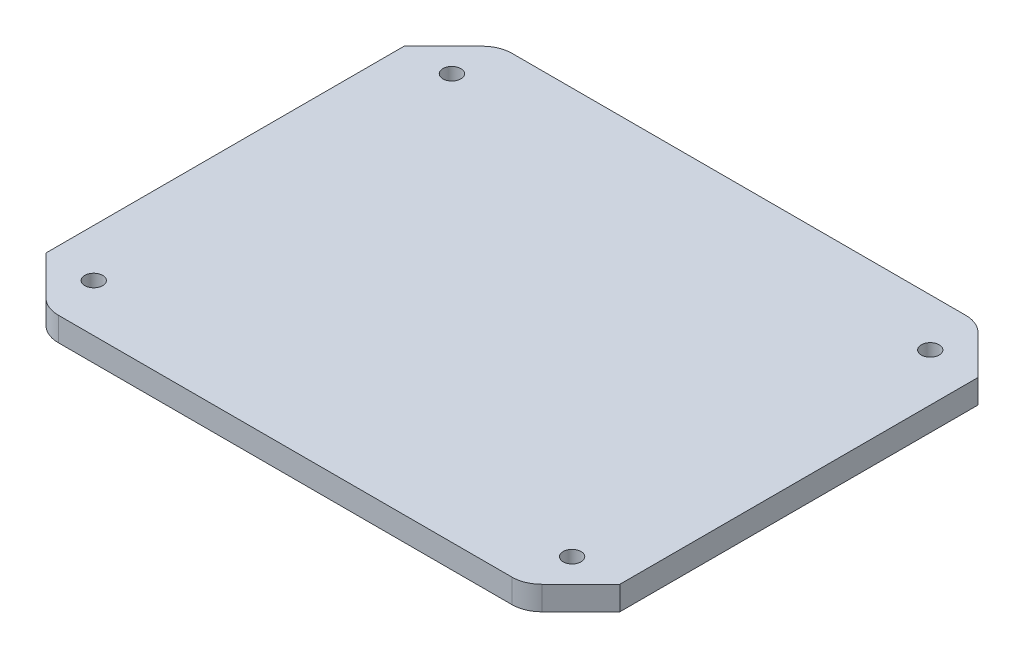
ISO-10303-21;
HEADER;
FILE_DESCRIPTION(('STEP AP214'),'2;1');
FILE_NAME('part.step','',(''),(''),'','','');
FILE_SCHEMA(('AUTOMOTIVE_DESIGN { 1 0 10303 214 1 1 1 1 }'));
ENDSEC;
DATA;
#1=APPLICATION_CONTEXT('core data for automotive mechanical design processes');
#2=APPLICATION_PROTOCOL_DEFINITION('international standard','automotive_design',2000,#1);
#3=PRODUCT_CONTEXT('',#1,'mechanical');
#4=PRODUCT('Part','Part','',(#3));
#5=PRODUCT_RELATED_PRODUCT_CATEGORY('part','',(#4));
#6=PRODUCT_DEFINITION_FORMATION('','',#4);
#7=PRODUCT_DEFINITION_CONTEXT('part definition',#1,'design');
#8=PRODUCT_DEFINITION('design','',#6,#7);
#9=PRODUCT_DEFINITION_SHAPE('','',#8);
#10=(LENGTH_UNIT() NAMED_UNIT(*) SI_UNIT(.MILLI.,.METRE.));
#11=(NAMED_UNIT(*) PLANE_ANGLE_UNIT() SI_UNIT($,.RADIAN.));
#12=(NAMED_UNIT(*) SI_UNIT($,.STERADIAN.) SOLID_ANGLE_UNIT());
#13=UNCERTAINTY_MEASURE_WITH_UNIT(LENGTH_MEASURE(1.E-05),#10,'distance_accuracy_value','');
#14=(GEOMETRIC_REPRESENTATION_CONTEXT(3) GLOBAL_UNCERTAINTY_ASSIGNED_CONTEXT((#13)) GLOBAL_UNIT_ASSIGNED_CONTEXT((#10,
#11,#12)) REPRESENTATION_CONTEXT('',''));
#15=CARTESIAN_POINT('',(0.,0.,0.));
#16=DIRECTION('',(0.,0.,1.));
#17=DIRECTION('',(1.,0.,0.));
#18=AXIS2_PLACEMENT_3D('',#15,#16,#17);
#19=CARTESIAN_POINT('',(-36.7097026254884,4.,-33.2150495624185));
#20=DIRECTION('',(0.,1.,0.));
#21=DIRECTION('',(0.,0.,1.));
#22=AXIS2_PLACEMENT_3D('',#19,#20,#21);
#23=PLANE('',#22);
#24=CARTESIAN_POINT('',(-38.7807704373538,4.,29.7849504375813));
#25=DIRECTION('',(0.,1.,0.));
#26=DIRECTION('',(0.,0.,1.));
#27=AXIS2_PLACEMENT_3D('',#24,#25,#26);
#28=CIRCLE('',#27,1.5);
#29=CARTESIAN_POINT('',(-38.7807704373538,4.,31.2849504375813));
#30=VERTEX_POINT('',#29);
#31=EDGE_CURVE('E290',#30,#30,#28,.T.);
#32=ORIENTED_EDGE('',*,*,#31,.F.);
#33=EDGE_LOOP('',(#32));
#34=FACE_BOUND('',#33,.T.);
#35=CARTESIAN_POINT('',(41.361365186377,4.,29.7849504375814));
#36=DIRECTION('',(0.,1.,0.));
#37=DIRECTION('',(0.,0.,1.));
#38=AXIS2_PLACEMENT_3D('',#35,#36,#37);
#39=CIRCLE('',#38,1.50000000000001);
#40=CARTESIAN_POINT('',(41.361365186377,4.,31.2849504375814));
#41=VERTEX_POINT('',#40);
#42=EDGE_CURVE('E157',#41,#41,#39,.T.);
#43=ORIENTED_EDGE('',*,*,#42,.F.);
#44=EDGE_LOOP('',(#43));
#45=FACE_BOUND('',#44,.T.);
#46=CARTESIAN_POINT('',(-36.7097026254884,4.,-33.2150495624185));
#47=DIRECTION('',(0.,1.,0.));
#48=DIRECTION('',(0.,0.,1.));
#49=AXIS2_PLACEMENT_3D('',#46,#47,#48);
#50=CIRCLE('',#49,5.);
#51=CARTESIAN_POINT('',(-36.7097026254883,4.,-38.2150495624185));
#52=VERTEX_POINT('',#51);
#53=CARTESIAN_POINT('',(-40.2452365314211,4.,-36.7505834683513));
#54=VERTEX_POINT('',#53);
#55=EDGE_CURVE('E176',#52,#54,#50,.T.);
#56=ORIENTED_EDGE('',*,*,#55,.T.);
#57=DIRECTION('',(-0.707106781186552,0.,0.707106781186543));
#58=VECTOR('',#57,1.);
#59=CARTESIAN_POINT('',(-40.2452365314211,4.,-36.7505834683513));
#60=LINE('',#59,#58);
#61=CARTESIAN_POINT('',(-46.7807704373538,4.,-30.2150495624187));
#62=VERTEX_POINT('',#61);
#63=EDGE_CURVE('E104',#54,#62,#60,.T.);
#64=ORIENTED_EDGE('',*,*,#63,.T.);
#65=DIRECTION('',(0.,0.,1.));
#66=VECTOR('',#65,1.);
#67=CARTESIAN_POINT('',(-46.7807704373538,4.,-30.2150495624187));
#68=LINE('',#67,#66);
#69=CARTESIAN_POINT('',(-46.7807704373538,4.,29.7849504375813));
#70=VERTEX_POINT('',#69);
#71=EDGE_CURVE('E203',#62,#70,#68,.T.);
#72=ORIENTED_EDGE('',*,*,#71,.T.);
#73=DIRECTION('',(0.707106781186547,0.,0.707106781186548));
#74=VECTOR('',#73,1.);
#75=CARTESIAN_POINT('',(-46.7807704373538,4.,29.7849504375813));
#76=LINE('',#75,#74);
#77=CARTESIAN_POINT('',(-40.2452365314211,4.,36.3204843435141));
#78=VERTEX_POINT('',#77);
#79=EDGE_CURVE('E222',#70,#78,#76,.T.);
#80=ORIENTED_EDGE('',*,*,#79,.T.);
#81=CARTESIAN_POINT('',(-36.7097026254883,4.,32.7849504375813));
#82=DIRECTION('',(0.,1.,0.));
#83=DIRECTION('',(0.,0.,1.));
#84=AXIS2_PLACEMENT_3D('',#81,#82,#83);
#85=CIRCLE('',#84,5.00000000000001);
#86=CARTESIAN_POINT('',(-36.7097026254883,4.,37.7849504375813));
#87=VERTEX_POINT('',#86);
#88=EDGE_CURVE('E219',#78,#87,#85,.T.);
#89=ORIENTED_EDGE('',*,*,#88,.T.);
#90=DIRECTION('',(1.,0.,0.));
#91=VECTOR('',#90,1.);
#92=CARTESIAN_POINT('',(-36.7097026254883,4.,37.7849504375813));
#93=LINE('',#92,#91);
#94=CARTESIAN_POINT('',(39.2902973745116,4.,37.7849504375813));
#95=VERTEX_POINT('',#94);
#96=EDGE_CURVE('E221',#87,#95,#93,.T.);
#97=ORIENTED_EDGE('',*,*,#96,.T.);
#98=CARTESIAN_POINT('',(39.2902973745116,4.,32.7849504375813));
#99=DIRECTION('',(0.,1.,0.));
#100=DIRECTION('',(0.,0.,1.));
#101=AXIS2_PLACEMENT_3D('',#98,#99,#100);
#102=CIRCLE('',#101,5.);
#103=CARTESIAN_POINT('',(42.8258312804443,4.,36.3204843435141));
#104=VERTEX_POINT('',#103);
#105=EDGE_CURVE('E224',#95,#104,#102,.T.);
#106=ORIENTED_EDGE('',*,*,#105,.T.);
#107=DIRECTION('',(0.707106781186547,0.,-0.707106781186548));
#108=VECTOR('',#107,1.);
#109=CARTESIAN_POINT('',(42.8258312804443,4.,36.3204843435141));
#110=LINE('',#109,#108);
#111=CARTESIAN_POINT('',(49.3613651863771,4.,29.7849504375813));
#112=VERTEX_POINT('',#111);
#113=EDGE_CURVE('E230',#104,#112,#110,.T.);
#114=ORIENTED_EDGE('',*,*,#113,.T.);
#115=DIRECTION('',(0.,0.,-1.));
#116=VECTOR('',#115,1.);
#117=CARTESIAN_POINT('',(49.3613651863771,4.,29.7849504375813));
#118=LINE('',#117,#116);
#119=CARTESIAN_POINT('',(49.3613651863771,4.,-30.2150495624187));
#120=VERTEX_POINT('',#119);
#121=EDGE_CURVE('E135',#112,#120,#118,.T.);
#122=ORIENTED_EDGE('',*,*,#121,.T.);
#123=DIRECTION('',(-0.707106781186556,0.,-0.707106781186539));
#124=VECTOR('',#123,1.);
#125=CARTESIAN_POINT('',(49.3613651863771,4.,-30.2150495624187));
#126=LINE('',#125,#124);
#127=CARTESIAN_POINT('',(42.8258312804443,4.,-36.7505834683513));
#128=VERTEX_POINT('',#127);
#129=EDGE_CURVE('E129',#120,#128,#126,.T.);
#130=ORIENTED_EDGE('',*,*,#129,.T.);
#131=CARTESIAN_POINT('',(39.2902973745116,4.,-33.2150495624185));
#132=DIRECTION('',(0.,1.,0.));
#133=DIRECTION('',(0.,0.,1.));
#134=AXIS2_PLACEMENT_3D('',#131,#132,#133);
#135=CIRCLE('',#134,5.);
#136=CARTESIAN_POINT('',(39.2902973745116,4.,-38.2150495624185));
#137=VERTEX_POINT('',#136);
#138=EDGE_CURVE('E133',#128,#137,#135,.T.);
#139=ORIENTED_EDGE('',*,*,#138,.T.);
#140=DIRECTION('',(-1.,0.,0.));
#141=VECTOR('',#140,1.);
#142=CARTESIAN_POINT('',(39.2902973745116,4.,-38.2150495624185));
#143=LINE('',#142,#141);
#144=EDGE_CURVE('E49',#137,#52,#143,.T.);
#145=ORIENTED_EDGE('',*,*,#144,.T.);
#146=EDGE_LOOP('',(#56,#64,#72,#80,#89,#97,#106,#114,#122,#130,#139,#145));
#147=FACE_BOUND('',#146,.T.);
#148=CARTESIAN_POINT('',(41.361365186377,4.,-30.2150495624188));
#149=DIRECTION('',(0.,1.,0.));
#150=DIRECTION('',(0.,0.,1.));
#151=AXIS2_PLACEMENT_3D('',#148,#149,#150);
#152=CIRCLE('',#151,1.5);
#153=CARTESIAN_POINT('',(41.361365186377,4.,-28.7150495624188));
#154=VERTEX_POINT('',#153);
#155=EDGE_CURVE('E296',#154,#154,#152,.T.);
#156=ORIENTED_EDGE('',*,*,#155,.F.);
#157=EDGE_LOOP('',(#156));
#158=FACE_BOUND('',#157,.T.);
#159=CARTESIAN_POINT('',(-38.7807704373538,4.,-30.2150495624187));
#160=DIRECTION('',(0.,1.,0.));
#161=DIRECTION('',(0.,0.,1.));
#162=AXIS2_PLACEMENT_3D('',#159,#160,#161);
#163=CIRCLE('',#162,1.5);
#164=CARTESIAN_POINT('',(-38.7807704373538,4.,-28.7150495624187));
#165=VERTEX_POINT('',#164);
#166=EDGE_CURVE('E281',#165,#165,#163,.T.);
#167=ORIENTED_EDGE('',*,*,#166,.F.);
#168=EDGE_LOOP('',(#167));
#169=FACE_BOUND('',#168,.T.);
#170=ADVANCED_FACE('F32',(#34,#45,#147,#158,#169),#23,.T.);
#171=CARTESIAN_POINT('',(-36.7097026254884,0.,-33.2150495624185));
#172=DIRECTION('',(0.,1.,0.));
#173=DIRECTION('',(0.,0.,1.));
#174=AXIS2_PLACEMENT_3D('',#171,#172,#173);
#175=PLANE('',#174);
#176=CARTESIAN_POINT('',(-36.7097026254884,0.,-33.2150495624185));
#177=DIRECTION('',(0.,1.,0.));
#178=DIRECTION('',(0.,0.,1.));
#179=AXIS2_PLACEMENT_3D('',#176,#177,#178);
#180=CIRCLE('',#179,5.);
#181=CARTESIAN_POINT('',(-36.7097026254883,0.,-38.2150495624185));
#182=VERTEX_POINT('',#181);
#183=CARTESIAN_POINT('',(-40.2452365314211,0.,-36.7505834683513));
#184=VERTEX_POINT('',#183);
#185=EDGE_CURVE('E153',#182,#184,#180,.T.);
#186=ORIENTED_EDGE('',*,*,#185,.F.);
#187=DIRECTION('',(-1.,0.,0.));
#188=VECTOR('',#187,1.);
#189=CARTESIAN_POINT('',(39.2902973745116,0.,-38.2150495624185));
#190=LINE('',#189,#188);
#191=CARTESIAN_POINT('',(39.2902973745116,0.,-38.2150495624185));
#192=VERTEX_POINT('',#191);
#193=EDGE_CURVE('E96',#192,#182,#190,.T.);
#194=ORIENTED_EDGE('',*,*,#193,.F.);
#195=CARTESIAN_POINT('',(39.2902973745116,0.,-33.2150495624185));
#196=DIRECTION('',(0.,1.,0.));
#197=DIRECTION('',(0.,0.,1.));
#198=AXIS2_PLACEMENT_3D('',#195,#196,#197);
#199=CIRCLE('',#198,5.);
#200=CARTESIAN_POINT('',(42.8258312804443,0.,-36.7505834683513));
#201=VERTEX_POINT('',#200);
#202=EDGE_CURVE('E90',#201,#192,#199,.T.);
#203=ORIENTED_EDGE('',*,*,#202,.F.);
#204=DIRECTION('',(-0.707106781186556,0.,-0.707106781186539));
#205=VECTOR('',#204,1.);
#206=CARTESIAN_POINT('',(49.3613651863771,0.,-30.2150495624187));
#207=LINE('',#206,#205);
#208=CARTESIAN_POINT('',(49.3613651863771,0.,-30.2150495624187));
#209=VERTEX_POINT('',#208);
#210=EDGE_CURVE('E143',#209,#201,#207,.T.);
#211=ORIENTED_EDGE('',*,*,#210,.F.);
#212=DIRECTION('',(0.,0.,-1.));
#213=VECTOR('',#212,1.);
#214=CARTESIAN_POINT('',(49.3613651863771,0.,29.7849504375813));
#215=LINE('',#214,#213);
#216=CARTESIAN_POINT('',(49.3613651863771,0.,29.7849504375813));
#217=VERTEX_POINT('',#216);
#218=EDGE_CURVE('E171',#217,#209,#215,.T.);
#219=ORIENTED_EDGE('',*,*,#218,.F.);
#220=DIRECTION('',(0.707106781186547,0.,-0.707106781186548));
#221=VECTOR('',#220,1.);
#222=CARTESIAN_POINT('',(42.8258312804443,0.,36.3204843435141));
#223=LINE('',#222,#221);
#224=CARTESIAN_POINT('',(42.8258312804443,0.,36.3204843435141));
#225=VERTEX_POINT('',#224);
#226=EDGE_CURVE('E169',#225,#217,#223,.T.);
#227=ORIENTED_EDGE('',*,*,#226,.F.);
#228=CARTESIAN_POINT('',(39.2902973745116,0.,32.7849504375813));
#229=DIRECTION('',(0.,1.,0.));
#230=DIRECTION('',(0.,0.,1.));
#231=AXIS2_PLACEMENT_3D('',#228,#229,#230);
#232=CIRCLE('',#231,5.);
#233=CARTESIAN_POINT('',(39.2902973745116,0.,37.7849504375813));
#234=VERTEX_POINT('',#233);
#235=EDGE_CURVE('E167',#234,#225,#232,.T.);
#236=ORIENTED_EDGE('',*,*,#235,.F.);
#237=DIRECTION('',(1.,0.,0.));
#238=VECTOR('',#237,1.);
#239=CARTESIAN_POINT('',(-36.7097026254883,0.,37.7849504375813));
#240=LINE('',#239,#238);
#241=CARTESIAN_POINT('',(-36.7097026254883,0.,37.7849504375813));
#242=VERTEX_POINT('',#241);
#243=EDGE_CURVE('E165',#242,#234,#240,.T.);
#244=ORIENTED_EDGE('',*,*,#243,.F.);
#245=CARTESIAN_POINT('',(-36.7097026254883,0.,32.7849504375813));
#246=DIRECTION('',(0.,1.,0.));
#247=DIRECTION('',(0.,0.,1.));
#248=AXIS2_PLACEMENT_3D('',#245,#246,#247);
#249=CIRCLE('',#248,5.00000000000001);
#250=CARTESIAN_POINT('',(-40.2452365314211,0.,36.3204843435141));
#251=VERTEX_POINT('',#250);
#252=EDGE_CURVE('E163',#251,#242,#249,.T.);
#253=ORIENTED_EDGE('',*,*,#252,.F.);
#254=DIRECTION('',(0.707106781186547,0.,0.707106781186548));
#255=VECTOR('',#254,1.);
#256=CARTESIAN_POINT('',(-46.7807704373538,0.,29.7849504375813));
#257=LINE('',#256,#255);
#258=CARTESIAN_POINT('',(-46.7807704373538,0.,29.7849504375813));
#259=VERTEX_POINT('',#258);
#260=EDGE_CURVE('E161',#259,#251,#257,.T.);
#261=ORIENTED_EDGE('',*,*,#260,.F.);
#262=DIRECTION('',(0.,0.,1.));
#263=VECTOR('',#262,1.);
#264=CARTESIAN_POINT('',(-46.7807704373538,0.,-30.2150495624187));
#265=LINE('',#264,#263);
#266=CARTESIAN_POINT('',(-46.7807704373538,0.,-30.2150495624187));
#267=VERTEX_POINT('',#266);
#268=EDGE_CURVE('E159',#267,#259,#265,.T.);
#269=ORIENTED_EDGE('',*,*,#268,.F.);
#270=DIRECTION('',(-0.707106781186552,0.,0.707106781186543));
#271=VECTOR('',#270,1.);
#272=CARTESIAN_POINT('',(-40.2452365314211,0.,-36.7505834683513));
#273=LINE('',#272,#271);
#274=EDGE_CURVE('E156',#184,#267,#273,.T.);
#275=ORIENTED_EDGE('',*,*,#274,.F.);
#276=EDGE_LOOP('',(#186,#194,#203,#211,#219,#227,#236,#244,#253,#261,#269,#275));
#277=FACE_BOUND('',#276,.T.);
#278=CARTESIAN_POINT('',(41.361365186377,0.,29.7849504375814));
#279=DIRECTION('',(0.,1.,0.));
#280=DIRECTION('',(0.,0.,1.));
#281=AXIS2_PLACEMENT_3D('',#278,#279,#280);
#282=CIRCLE('',#281,1.50000000000001);
#283=CARTESIAN_POINT('',(41.361365186377,0.,31.2849504375814));
#284=VERTEX_POINT('',#283);
#285=EDGE_CURVE('E299',#284,#284,#282,.T.);
#286=ORIENTED_EDGE('',*,*,#285,.T.);
#287=EDGE_LOOP('',(#286));
#288=FACE_BOUND('',#287,.T.);
#289=CARTESIAN_POINT('',(41.361365186377,0.,-30.2150495624188));
#290=DIRECTION('',(0.,1.,0.));
#291=DIRECTION('',(0.,0.,1.));
#292=AXIS2_PLACEMENT_3D('',#289,#290,#291);
#293=CIRCLE('',#292,1.5);
#294=CARTESIAN_POINT('',(41.361365186377,0.,-28.7150495624188));
#295=VERTEX_POINT('',#294);
#296=EDGE_CURVE('E293',#295,#295,#293,.T.);
#297=ORIENTED_EDGE('',*,*,#296,.T.);
#298=EDGE_LOOP('',(#297));
#299=FACE_BOUND('',#298,.T.);
#300=CARTESIAN_POINT('',(-38.7807704373538,0.,29.7849504375813));
#301=DIRECTION('',(0.,1.,0.));
#302=DIRECTION('',(0.,0.,1.));
#303=AXIS2_PLACEMENT_3D('',#300,#301,#302);
#304=CIRCLE('',#303,1.5);
#305=CARTESIAN_POINT('',(-38.7807704373538,0.,31.2849504375813));
#306=VERTEX_POINT('',#305);
#307=EDGE_CURVE('E287',#306,#306,#304,.T.);
#308=ORIENTED_EDGE('',*,*,#307,.T.);
#309=EDGE_LOOP('',(#308));
#310=FACE_BOUND('',#309,.T.);
#311=CARTESIAN_POINT('',(-38.7807704373538,0.,-30.2150495624187));
#312=DIRECTION('',(0.,1.,0.));
#313=DIRECTION('',(0.,0.,1.));
#314=AXIS2_PLACEMENT_3D('',#311,#312,#313);
#315=CIRCLE('',#314,1.5);
#316=CARTESIAN_POINT('',(-38.7807704373538,0.,-28.7150495624187));
#317=VERTEX_POINT('',#316);
#318=EDGE_CURVE('E284',#317,#317,#315,.T.);
#319=ORIENTED_EDGE('',*,*,#318,.T.);
#320=EDGE_LOOP('',(#319));
#321=FACE_BOUND('',#320,.T.);
#322=ADVANCED_FACE('F207',(#277,#288,#299,#310,#321),#175,.F.);
#323=CARTESIAN_POINT('',(-36.7097026254884,4.,-33.2150495624185));
#324=DIRECTION('',(0.,-1.,0.));
#325=DIRECTION('',(0.,0.,-1.));
#326=AXIS2_PLACEMENT_3D('',#323,#324,#325);
#327=CYLINDRICAL_SURFACE('',#326,5.);
#328=ORIENTED_EDGE('',*,*,#185,.T.);
#329=DIRECTION('',(0.,-1.,0.));
#330=VECTOR('',#329,1.);
#331=CARTESIAN_POINT('',(-40.2452365314211,4.,-36.7505834683513));
#332=LINE('',#331,#330);
#333=EDGE_CURVE('E11',#54,#184,#332,.T.);
#334=ORIENTED_EDGE('',*,*,#333,.F.);
#335=ORIENTED_EDGE('',*,*,#55,.F.);
#336=DIRECTION('',(0.,-1.,0.));
#337=VECTOR('',#336,1.);
#338=CARTESIAN_POINT('',(-36.7097026254883,4.,-38.2150495624185));
#339=LINE('',#338,#337);
#340=EDGE_CURVE('E149',#52,#182,#339,.T.);
#341=ORIENTED_EDGE('',*,*,#340,.T.);
#342=EDGE_LOOP('',(#328,#334,#335,#341));
#343=FACE_BOUND('',#342,.T.);
#344=ADVANCED_FACE('F34',(#343),#327,.T.);
#345=CARTESIAN_POINT('',(-40.2452365314211,4.,-36.7505834683513));
#346=DIRECTION('',(0.707106781186543,0.,0.707106781186552));
#347=DIRECTION('',(0.707106781186552,0.,-0.707106781186543));
#348=AXIS2_PLACEMENT_3D('',#345,#346,#347);
#349=PLANE('',#348);
#350=ORIENTED_EDGE('',*,*,#274,.T.);
#351=DIRECTION('',(0.,-1.,0.));
#352=VECTOR('',#351,1.);
#353=CARTESIAN_POINT('',(-46.7807704373538,4.,-30.2150495624187));
#354=LINE('',#353,#352);
#355=EDGE_CURVE('E41',#62,#267,#354,.T.);
#356=ORIENTED_EDGE('',*,*,#355,.F.);
#357=ORIENTED_EDGE('',*,*,#63,.F.);
#358=ORIENTED_EDGE('',*,*,#333,.T.);
#359=EDGE_LOOP('',(#350,#356,#357,#358));
#360=FACE_BOUND('',#359,.T.);
#361=ADVANCED_FACE('F409',(#360),#349,.F.);
#362=CARTESIAN_POINT('',(-46.7807704373538,4.,-30.2150495624187));
#363=DIRECTION('',(1.,0.,0.));
#364=DIRECTION('',(0.,0.,-1.));
#365=AXIS2_PLACEMENT_3D('',#362,#363,#364);
#366=PLANE('',#365);
#367=ORIENTED_EDGE('',*,*,#268,.T.);
#368=DIRECTION('',(0.,-1.,0.));
#369=VECTOR('',#368,1.);
#370=CARTESIAN_POINT('',(-46.7807704373538,4.,29.7849504375813));
#371=LINE('',#370,#369);
#372=EDGE_CURVE('E195',#70,#259,#371,.T.);
#373=ORIENTED_EDGE('',*,*,#372,.F.);
#374=ORIENTED_EDGE('',*,*,#71,.F.);
#375=ORIENTED_EDGE('',*,*,#355,.T.);
#376=EDGE_LOOP('',(#367,#373,#374,#375));
#377=FACE_BOUND('',#376,.T.);
#378=ADVANCED_FACE('F201',(#377),#366,.F.);
#379=CARTESIAN_POINT('',(-46.7807704373538,4.,29.7849504375813));
#380=DIRECTION('',(0.707106781186548,0.,-0.707106781186547));
#381=DIRECTION('',(-0.707106781186547,0.,-0.707106781186548));
#382=AXIS2_PLACEMENT_3D('',#379,#380,#381);
#383=PLANE('',#382);
#384=ORIENTED_EDGE('',*,*,#260,.T.);
#385=DIRECTION('',(0.,-1.,0.));
#386=VECTOR('',#385,1.);
#387=CARTESIAN_POINT('',(-40.2452365314211,4.,36.3204843435141));
#388=LINE('',#387,#386);
#389=EDGE_CURVE('E192',#78,#251,#388,.T.);
#390=ORIENTED_EDGE('',*,*,#389,.F.);
#391=ORIENTED_EDGE('',*,*,#79,.F.);
#392=ORIENTED_EDGE('',*,*,#372,.T.);
#393=EDGE_LOOP('',(#384,#390,#391,#392));
#394=FACE_BOUND('',#393,.T.);
#395=ADVANCED_FACE('F213',(#394),#383,.F.);
#396=CARTESIAN_POINT('',(-36.7097026254883,4.,32.7849504375813));
#397=DIRECTION('',(0.,-1.,0.));
#398=DIRECTION('',(0.,0.,-1.));
#399=AXIS2_PLACEMENT_3D('',#396,#397,#398);
#400=CYLINDRICAL_SURFACE('',#399,5.00000000000001);
#401=ORIENTED_EDGE('',*,*,#252,.T.);
#402=DIRECTION('',(0.,-1.,0.));
#403=VECTOR('',#402,1.);
#404=CARTESIAN_POINT('',(-36.7097026254883,4.,37.7849504375813));
#405=LINE('',#404,#403);
#406=EDGE_CURVE('E189',#87,#242,#405,.T.);
#407=ORIENTED_EDGE('',*,*,#406,.F.);
#408=ORIENTED_EDGE('',*,*,#88,.F.);
#409=ORIENTED_EDGE('',*,*,#389,.T.);
#410=EDGE_LOOP('',(#401,#407,#408,#409));
#411=FACE_BOUND('',#410,.T.);
#412=ADVANCED_FACE('F217',(#411),#400,.T.);
#413=CARTESIAN_POINT('',(-36.7097026254883,4.,37.7849504375813));
#414=DIRECTION('',(0.,0.,-1.));
#415=DIRECTION('',(-1.,0.,0.));
#416=AXIS2_PLACEMENT_3D('',#413,#414,#415);
#417=PLANE('',#416);
#418=ORIENTED_EDGE('',*,*,#243,.T.);
#419=DIRECTION('',(0.,-1.,0.));
#420=VECTOR('',#419,1.);
#421=CARTESIAN_POINT('',(39.2902973745116,4.,37.7849504375813));
#422=LINE('',#421,#420);
#423=EDGE_CURVE('E186',#95,#234,#422,.T.);
#424=ORIENTED_EDGE('',*,*,#423,.F.);
#425=ORIENTED_EDGE('',*,*,#96,.F.);
#426=ORIENTED_EDGE('',*,*,#406,.T.);
#427=EDGE_LOOP('',(#418,#424,#425,#426));
#428=FACE_BOUND('',#427,.T.);
#429=ADVANCED_FACE('F374',(#428),#417,.F.);
#430=CARTESIAN_POINT('',(39.2902973745116,4.,32.7849504375813));
#431=DIRECTION('',(0.,-1.,0.));
#432=DIRECTION('',(0.,0.,-1.));
#433=AXIS2_PLACEMENT_3D('',#430,#431,#432);
#434=CYLINDRICAL_SURFACE('',#433,5.);
#435=ORIENTED_EDGE('',*,*,#235,.T.);
#436=DIRECTION('',(0.,-1.,0.));
#437=VECTOR('',#436,1.);
#438=CARTESIAN_POINT('',(42.8258312804443,4.,36.3204843435141));
#439=LINE('',#438,#437);
#440=EDGE_CURVE('E183',#104,#225,#439,.T.);
#441=ORIENTED_EDGE('',*,*,#440,.F.);
#442=ORIENTED_EDGE('',*,*,#105,.F.);
#443=ORIENTED_EDGE('',*,*,#423,.T.);
#444=EDGE_LOOP('',(#435,#441,#442,#443));
#445=FACE_BOUND('',#444,.T.);
#446=ADVANCED_FACE('F365',(#445),#434,.T.);
#447=CARTESIAN_POINT('',(42.8258312804443,4.,36.3204843435141));
#448=DIRECTION('',(-0.707106781186548,0.,-0.707106781186547));
#449=DIRECTION('',(-0.707106781186547,0.,0.707106781186548));
#450=AXIS2_PLACEMENT_3D('',#447,#448,#449);
#451=PLANE('',#450);
#452=ORIENTED_EDGE('',*,*,#226,.T.);
#453=DIRECTION('',(0.,-1.,0.));
#454=VECTOR('',#453,1.);
#455=CARTESIAN_POINT('',(49.3613651863771,4.,29.7849504375813));
#456=LINE('',#455,#454);
#457=EDGE_CURVE('E180',#112,#217,#456,.T.);
#458=ORIENTED_EDGE('',*,*,#457,.F.);
#459=ORIENTED_EDGE('',*,*,#113,.F.);
#460=ORIENTED_EDGE('',*,*,#440,.T.);
#461=EDGE_LOOP('',(#452,#458,#459,#460));
#462=FACE_BOUND('',#461,.T.);
#463=ADVANCED_FACE('F236',(#462),#451,.F.);
#464=CARTESIAN_POINT('',(49.3613651863771,4.,29.7849504375813));
#465=DIRECTION('',(-1.,0.,0.));
#466=DIRECTION('',(0.,0.,1.));
#467=AXIS2_PLACEMENT_3D('',#464,#465,#466);
#468=PLANE('',#467);
#469=ORIENTED_EDGE('',*,*,#218,.T.);
#470=DIRECTION('',(0.,-1.,0.));
#471=VECTOR('',#470,1.);
#472=CARTESIAN_POINT('',(49.3613651863771,4.,-30.2150495624187));
#473=LINE('',#472,#471);
#474=EDGE_CURVE('E144',#120,#209,#473,.T.);
#475=ORIENTED_EDGE('',*,*,#474,.F.);
#476=ORIENTED_EDGE('',*,*,#121,.F.);
#477=ORIENTED_EDGE('',*,*,#457,.T.);
#478=EDGE_LOOP('',(#469,#475,#476,#477));
#479=FACE_BOUND('',#478,.T.);
#480=ADVANCED_FACE('F240',(#479),#468,.F.);
#481=CARTESIAN_POINT('',(49.3613651863771,4.,-30.2150495624187));
#482=DIRECTION('',(-0.707106781186539,0.,0.707106781186556));
#483=DIRECTION('',(0.707106781186556,0.,0.707106781186539));
#484=AXIS2_PLACEMENT_3D('',#481,#482,#483);
#485=PLANE('',#484);
#486=ORIENTED_EDGE('',*,*,#210,.T.);
#487=DIRECTION('',(0.,-1.,0.));
#488=VECTOR('',#487,1.);
#489=CARTESIAN_POINT('',(42.8258312804443,4.,-36.7505834683513));
#490=LINE('',#489,#488);
#491=EDGE_CURVE('E140',#128,#201,#490,.T.);
#492=ORIENTED_EDGE('',*,*,#491,.F.);
#493=ORIENTED_EDGE('',*,*,#129,.F.);
#494=ORIENTED_EDGE('',*,*,#474,.T.);
#495=EDGE_LOOP('',(#486,#492,#493,#494));
#496=FACE_BOUND('',#495,.T.);
#497=ADVANCED_FACE('F141',(#496),#485,.F.);
#498=CARTESIAN_POINT('',(39.2902973745116,4.,-33.2150495624185));
#499=DIRECTION('',(0.,-1.,0.));
#500=DIRECTION('',(0.,0.,-1.));
#501=AXIS2_PLACEMENT_3D('',#498,#499,#500);
#502=CYLINDRICAL_SURFACE('',#501,5.);
#503=ORIENTED_EDGE('',*,*,#202,.T.);
#504=DIRECTION('',(0.,-1.,0.));
#505=VECTOR('',#504,1.);
#506=CARTESIAN_POINT('',(39.2902973745116,4.,-38.2150495624185));
#507=LINE('',#506,#505);
#508=EDGE_CURVE('E145',#137,#192,#507,.T.);
#509=ORIENTED_EDGE('',*,*,#508,.F.);
#510=ORIENTED_EDGE('',*,*,#138,.F.);
#511=ORIENTED_EDGE('',*,*,#491,.T.);
#512=EDGE_LOOP('',(#503,#509,#510,#511));
#513=FACE_BOUND('',#512,.T.);
#514=ADVANCED_FACE('F147',(#513),#502,.T.);
#515=CARTESIAN_POINT('',(39.2902973745116,4.,-38.2150495624185));
#516=DIRECTION('',(0.,0.,1.));
#517=DIRECTION('',(1.,0.,0.));
#518=AXIS2_PLACEMENT_3D('',#515,#516,#517);
#519=PLANE('',#518);
#520=ORIENTED_EDGE('',*,*,#193,.T.);
#521=ORIENTED_EDGE('',*,*,#340,.F.);
#522=ORIENTED_EDGE('',*,*,#144,.F.);
#523=ORIENTED_EDGE('',*,*,#508,.T.);
#524=EDGE_LOOP('',(#520,#521,#522,#523));
#525=FACE_BOUND('',#524,.T.);
#526=ADVANCED_FACE('F244',(#525),#519,.F.);
#527=CARTESIAN_POINT('',(41.361365186377,4.,29.7849504375814));
#528=DIRECTION('',(0.,-1.,0.));
#529=DIRECTION('',(0.,0.,-1.));
#530=AXIS2_PLACEMENT_3D('',#527,#528,#529);
#531=CYLINDRICAL_SURFACE('',#530,1.50000000000001);
#532=ORIENTED_EDGE('',*,*,#42,.T.);
#533=EDGE_LOOP('',(#532));
#534=FACE_BOUND('',#533,.T.);
#535=ORIENTED_EDGE('',*,*,#285,.F.);
#536=EDGE_LOOP('',(#535));
#537=FACE_BOUND('',#536,.T.);
#538=ADVANCED_FACE('F246',(#534,#537),#531,.F.);
#539=CARTESIAN_POINT('',(41.361365186377,4.,-30.2150495624188));
#540=DIRECTION('',(0.,-1.,0.));
#541=DIRECTION('',(0.,0.,-1.));
#542=AXIS2_PLACEMENT_3D('',#539,#540,#541);
#543=CYLINDRICAL_SURFACE('',#542,1.5);
#544=ORIENTED_EDGE('',*,*,#155,.T.);
#545=EDGE_LOOP('',(#544));
#546=FACE_BOUND('',#545,.T.);
#547=ORIENTED_EDGE('',*,*,#296,.F.);
#548=EDGE_LOOP('',(#547));
#549=FACE_BOUND('',#548,.T.);
#550=ADVANCED_FACE('F252',(#546,#549),#543,.F.);
#551=CARTESIAN_POINT('',(-38.7807704373538,4.,29.7849504375813));
#552=DIRECTION('',(0.,-1.,0.));
#553=DIRECTION('',(0.,0.,-1.));
#554=AXIS2_PLACEMENT_3D('',#551,#552,#553);
#555=CYLINDRICAL_SURFACE('',#554,1.5);
#556=ORIENTED_EDGE('',*,*,#31,.T.);
#557=EDGE_LOOP('',(#556));
#558=FACE_BOUND('',#557,.T.);
#559=ORIENTED_EDGE('',*,*,#307,.F.);
#560=EDGE_LOOP('',(#559));
#561=FACE_BOUND('',#560,.T.);
#562=ADVANCED_FACE('F268',(#558,#561),#555,.F.);
#563=CARTESIAN_POINT('',(-38.7807704373538,4.,-30.2150495624187));
#564=DIRECTION('',(0.,-1.,0.));
#565=DIRECTION('',(0.,0.,-1.));
#566=AXIS2_PLACEMENT_3D('',#563,#564,#565);
#567=CYLINDRICAL_SURFACE('',#566,1.5);
#568=ORIENTED_EDGE('',*,*,#166,.T.);
#569=EDGE_LOOP('',(#568));
#570=FACE_BOUND('',#569,.T.);
#571=ORIENTED_EDGE('',*,*,#318,.F.);
#572=EDGE_LOOP('',(#571));
#573=FACE_BOUND('',#572,.T.);
#574=ADVANCED_FACE('F272',(#570,#573),#567,.F.);
#575=CLOSED_SHELL('',(#170,#322,#344,#361,#378,#395,#412,#429,#446,#463,#480,#497,#514,#526,
#538,#550,#562,#574));
#576=MANIFOLD_SOLID_BREP('B2',#575);
#577=ADVANCED_BREP_SHAPE_REPRESENTATION('',(#18,#576),#14);
#578=SHAPE_DEFINITION_REPRESENTATION(#9,#577);
ENDSEC;
END-ISO-10303-21;
